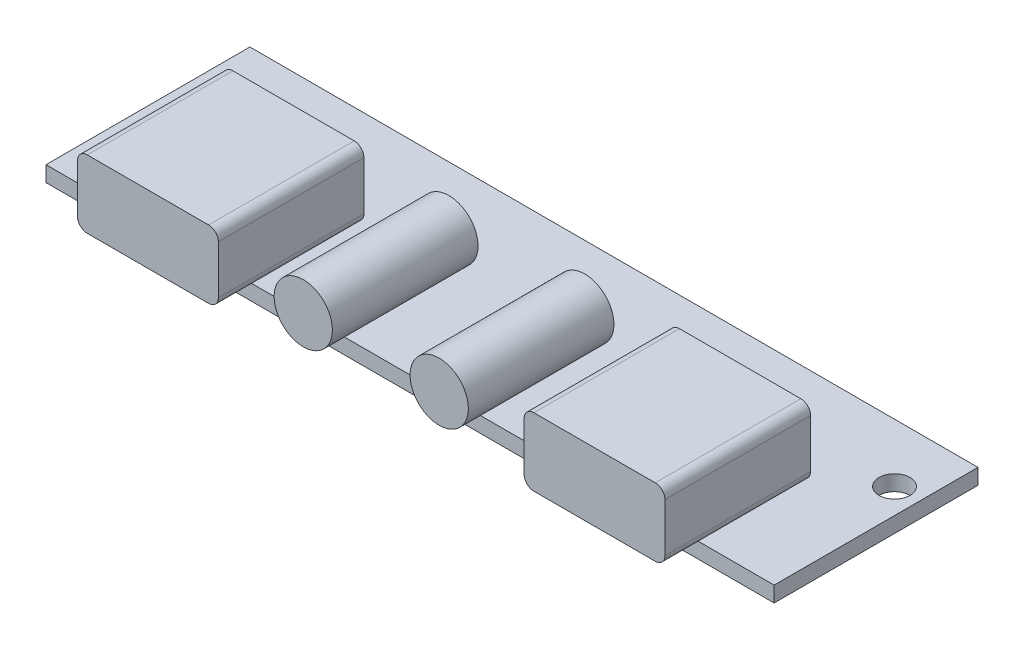
ISO-10303-21;
HEADER;
FILE_DESCRIPTION(('STEP AP214'),'2;1');
FILE_NAME('part.step','',(''),(''),'','','');
FILE_SCHEMA(('AUTOMOTIVE_DESIGN { 1 0 10303 214 1 1 1 1 }'));
ENDSEC;
DATA;
#1=APPLICATION_CONTEXT('core data for automotive mechanical design processes');
#2=APPLICATION_PROTOCOL_DEFINITION('international standard','automotive_design',2000,#1);
#3=PRODUCT_CONTEXT('',#1,'mechanical');
#4=PRODUCT('Part','Part','',(#3));
#5=PRODUCT_RELATED_PRODUCT_CATEGORY('part','',(#4));
#6=PRODUCT_DEFINITION_FORMATION('','',#4);
#7=PRODUCT_DEFINITION_CONTEXT('part definition',#1,'design');
#8=PRODUCT_DEFINITION('design','',#6,#7);
#9=PRODUCT_DEFINITION_SHAPE('','',#8);
#10=(LENGTH_UNIT() NAMED_UNIT(*) SI_UNIT(.MILLI.,.METRE.));
#11=(NAMED_UNIT(*) PLANE_ANGLE_UNIT() SI_UNIT($,.RADIAN.));
#12=(NAMED_UNIT(*) SI_UNIT($,.STERADIAN.) SOLID_ANGLE_UNIT());
#13=UNCERTAINTY_MEASURE_WITH_UNIT(LENGTH_MEASURE(1.E-05),#10,'distance_accuracy_value','');
#14=(GEOMETRIC_REPRESENTATION_CONTEXT(3) GLOBAL_UNCERTAINTY_ASSIGNED_CONTEXT((#13)) GLOBAL_UNIT_ASSIGNED_CONTEXT((#10,
#11,#12)) REPRESENTATION_CONTEXT('',''));
#15=CARTESIAN_POINT('',(0.,0.,0.));
#16=DIRECTION('',(0.,0.,1.));
#17=DIRECTION('',(1.,0.,0.));
#18=AXIS2_PLACEMENT_3D('',#15,#16,#17);
#19=CARTESIAN_POINT('',(7.,5.6,-0.499999999999991));
#20=DIRECTION('',(0.,0.,1.));
#21=DIRECTION('',(-1.,0.,0.));
#22=AXIS2_PLACEMENT_3D('',#19,#20,#21);
#23=CYLINDRICAL_SURFACE('',#22,3.);
#24=CARTESIAN_POINT('',(7.,5.6,-0.499999999999991));
#25=DIRECTION('',(0.,0.,-1.));
#26=DIRECTION('',(-1.,0.,0.));
#27=AXIS2_PLACEMENT_3D('',#24,#25,#26);
#28=CIRCLE('',#27,3.);
#29=CARTESIAN_POINT('',(4.,5.6,-0.499999999999992));
#30=VERTEX_POINT('',#29);
#31=EDGE_CURVE('E11',#30,#30,#28,.T.);
#32=ORIENTED_EDGE('',*,*,#31,.F.);
#33=EDGE_LOOP('',(#32));
#34=FACE_BOUND('',#33,.T.);
#35=CARTESIAN_POINT('',(7.,5.6,14.5));
#36=DIRECTION('',(0.,0.,-1.));
#37=DIRECTION('',(-1.,0.,0.));
#38=AXIS2_PLACEMENT_3D('',#35,#36,#37);
#39=CIRCLE('',#38,3.);
#40=CARTESIAN_POINT('',(4.,5.6,14.5));
#41=VERTEX_POINT('',#40);
#42=EDGE_CURVE('E44',#41,#41,#39,.T.);
#43=ORIENTED_EDGE('',*,*,#42,.T.);
#44=EDGE_LOOP('',(#43));
#45=FACE_BOUND('',#44,.T.);
#46=ADVANCED_FACE('F41',(#34,#45),#23,.T.);
#47=CARTESIAN_POINT('',(7.,5.6,-0.499999999999991));
#48=DIRECTION('',(0.,0.,1.));
#49=DIRECTION('',(-1.,0.,0.));
#50=AXIS2_PLACEMENT_3D('',#47,#48,#49);
#51=PLANE('',#50);
#52=ORIENTED_EDGE('',*,*,#31,.T.);
#53=EDGE_LOOP('',(#52));
#54=FACE_BOUND('',#53,.T.);
#55=ADVANCED_FACE('F56',(#54),#51,.F.);
#56=CARTESIAN_POINT('',(7.,5.6,14.5));
#57=DIRECTION('',(0.,0.,1.));
#58=DIRECTION('',(-1.,0.,0.));
#59=AXIS2_PLACEMENT_3D('',#56,#57,#58);
#60=PLANE('',#59);
#61=ORIENTED_EDGE('',*,*,#42,.F.);
#62=EDGE_LOOP('',(#61));
#63=FACE_BOUND('',#62,.T.);
#64=ADVANCED_FACE('F54',(#63),#60,.T.);
#65=CLOSED_SHELL('',(#46,#55,#64));
#66=MANIFOLD_SOLID_BREP('B2',#65);
#67=CARTESIAN_POINT('',(29.25,2.6,-0.499999999999984));
#68=DIRECTION('',(0.,0.,1.));
#69=DIRECTION('',(-1.,0.,0.));
#70=AXIS2_PLACEMENT_3D('',#67,#68,#69);
#71=CYLINDRICAL_SURFACE('',#70,1.);
#72=CARTESIAN_POINT('',(29.25,2.6,14.5));
#73=DIRECTION('',(0.,0.,-1.));
#74=DIRECTION('',(1.,0.,0.));
#75=AXIS2_PLACEMENT_3D('',#72,#73,#74);
#76=CIRCLE('',#75,1.);
#77=CARTESIAN_POINT('',(30.25,2.6,14.5));
#78=VERTEX_POINT('',#77);
#79=CARTESIAN_POINT('',(29.25,1.6,14.5));
#80=VERTEX_POINT('',#79);
#81=EDGE_CURVE('E187',#78,#80,#76,.T.);
#82=ORIENTED_EDGE('',*,*,#81,.T.);
#83=DIRECTION('',(0.,0.,1.));
#84=VECTOR('',#83,1.);
#85=CARTESIAN_POINT('',(29.25,1.6,-0.499999999999984));
#86=LINE('',#85,#84);
#87=CARTESIAN_POINT('',(29.25,1.6,-0.499999999999984));
#88=VERTEX_POINT('',#87);
#89=EDGE_CURVE('E94',#88,#80,#86,.T.);
#90=ORIENTED_EDGE('',*,*,#89,.F.);
#91=CARTESIAN_POINT('',(29.25,2.6,-0.499999999999984));
#92=DIRECTION('',(0.,0.,-1.));
#93=DIRECTION('',(1.,0.,0.));
#94=AXIS2_PLACEMENT_3D('',#91,#92,#93);
#95=CIRCLE('',#94,1.);
#96=CARTESIAN_POINT('',(30.25,2.6,-0.499999999999984));
#97=VERTEX_POINT('',#96);
#98=EDGE_CURVE('E200',#97,#88,#95,.T.);
#99=ORIENTED_EDGE('',*,*,#98,.F.);
#100=DIRECTION('',(0.,0.,1.));
#101=VECTOR('',#100,1.);
#102=CARTESIAN_POINT('',(30.25,2.6,-0.499999999999984));
#103=LINE('',#102,#101);
#104=EDGE_CURVE('E39',#97,#78,#103,.T.);
#105=ORIENTED_EDGE('',*,*,#104,.T.);
#106=EDGE_LOOP('',(#82,#90,#99,#105));
#107=FACE_BOUND('',#106,.T.);
#108=ADVANCED_FACE('F91',(#107),#71,.T.);
#109=CARTESIAN_POINT('',(30.25,7.6,-0.499999999999984));
#110=DIRECTION('',(1.,0.,0.));
#111=DIRECTION('',(0.,-1.,0.));
#112=AXIS2_PLACEMENT_3D('',#109,#110,#111);
#113=PLANE('',#112);
#114=DIRECTION('',(0.,-1.,0.));
#115=VECTOR('',#114,1.);
#116=CARTESIAN_POINT('',(30.25,7.6,14.5));
#117=LINE('',#116,#115);
#118=CARTESIAN_POINT('',(30.25,7.6,14.5));
#119=VERTEX_POINT('',#118);
#120=EDGE_CURVE('E144',#119,#78,#117,.T.);
#121=ORIENTED_EDGE('',*,*,#120,.T.);
#122=ORIENTED_EDGE('',*,*,#104,.F.);
#123=DIRECTION('',(0.,-1.,0.));
#124=VECTOR('',#123,1.);
#125=CARTESIAN_POINT('',(30.25,7.6,-0.499999999999984));
#126=LINE('',#125,#124);
#127=CARTESIAN_POINT('',(30.25,7.6,-0.499999999999984));
#128=VERTEX_POINT('',#127);
#129=EDGE_CURVE('E109',#128,#97,#126,.T.);
#130=ORIENTED_EDGE('',*,*,#129,.F.);
#131=DIRECTION('',(0.,0.,1.));
#132=VECTOR('',#131,1.);
#133=CARTESIAN_POINT('',(30.25,7.6,-0.499999999999984));
#134=LINE('',#133,#132);
#135=EDGE_CURVE('E100',#128,#119,#134,.T.);
#136=ORIENTED_EDGE('',*,*,#135,.T.);
#137=EDGE_LOOP('',(#121,#122,#130,#136));
#138=FACE_BOUND('',#137,.T.);
#139=ADVANCED_FACE('F246',(#138),#113,.T.);
#140=CARTESIAN_POINT('',(29.25,7.6,-0.499999999999984));
#141=DIRECTION('',(0.,0.,1.));
#142=DIRECTION('',(-1.,0.,0.));
#143=AXIS2_PLACEMENT_3D('',#140,#141,#142);
#144=CYLINDRICAL_SURFACE('',#143,0.999999999999999);
#145=CARTESIAN_POINT('',(29.25,7.6,14.5));
#146=DIRECTION('',(0.,0.,-1.));
#147=DIRECTION('',(-1.,0.,0.));
#148=AXIS2_PLACEMENT_3D('',#145,#146,#147);
#149=CIRCLE('',#148,0.999999999999999);
#150=CARTESIAN_POINT('',(29.25,8.6,14.5));
#151=VERTEX_POINT('',#150);
#152=EDGE_CURVE('E138',#151,#119,#149,.T.);
#153=ORIENTED_EDGE('',*,*,#152,.T.);
#154=ORIENTED_EDGE('',*,*,#135,.F.);
#155=CARTESIAN_POINT('',(29.25,7.6,-0.499999999999984));
#156=DIRECTION('',(0.,0.,-1.));
#157=DIRECTION('',(-1.,0.,0.));
#158=AXIS2_PLACEMENT_3D('',#155,#156,#157);
#159=CIRCLE('',#158,0.999999999999999);
#160=CARTESIAN_POINT('',(29.25,8.6,-0.499999999999984));
#161=VERTEX_POINT('',#160);
#162=EDGE_CURVE('E169',#161,#128,#159,.T.);
#163=ORIENTED_EDGE('',*,*,#162,.F.);
#164=DIRECTION('',(0.,0.,1.));
#165=VECTOR('',#164,1.);
#166=CARTESIAN_POINT('',(29.25,8.6,-0.499999999999984));
#167=LINE('',#166,#165);
#168=EDGE_CURVE('E176',#161,#151,#167,.T.);
#169=ORIENTED_EDGE('',*,*,#168,.T.);
#170=EDGE_LOOP('',(#153,#154,#163,#169));
#171=FACE_BOUND('',#170,.T.);
#172=ADVANCED_FACE('F182',(#171),#144,.T.);
#173=CARTESIAN_POINT('',(29.25,8.6,-0.499999999999984));
#174=DIRECTION('',(0.,1.,0.));
#175=DIRECTION('',(0.,0.,1.));
#176=AXIS2_PLACEMENT_3D('',#173,#174,#175);
#177=PLANE('',#176);
#178=DIRECTION('',(1.,0.,0.));
#179=VECTOR('',#178,1.);
#180=CARTESIAN_POINT('',(29.25,8.6,14.5));
#181=LINE('',#180,#179);
#182=CARTESIAN_POINT('',(16.75,8.6,14.5));
#183=VERTEX_POINT('',#182);
#184=EDGE_CURVE('E179',#183,#151,#181,.T.);
#185=ORIENTED_EDGE('',*,*,#184,.T.);
#186=ORIENTED_EDGE('',*,*,#168,.F.);
#187=DIRECTION('',(1.,0.,0.));
#188=VECTOR('',#187,1.);
#189=CARTESIAN_POINT('',(29.25,8.6,-0.499999999999984));
#190=LINE('',#189,#188);
#191=CARTESIAN_POINT('',(16.75,8.6,-0.499999999999988));
#192=VERTEX_POINT('',#191);
#193=EDGE_CURVE('E165',#192,#161,#190,.T.);
#194=ORIENTED_EDGE('',*,*,#193,.F.);
#195=DIRECTION('',(0.,0.,1.));
#196=VECTOR('',#195,1.);
#197=CARTESIAN_POINT('',(16.75,8.6,-0.499999999999988));
#198=LINE('',#197,#196);
#199=EDGE_CURVE('E180',#192,#183,#198,.T.);
#200=ORIENTED_EDGE('',*,*,#199,.T.);
#201=EDGE_LOOP('',(#185,#186,#194,#200));
#202=FACE_BOUND('',#201,.T.);
#203=ADVANCED_FACE('F177',(#202),#177,.T.);
#204=CARTESIAN_POINT('',(16.75,7.6,-0.499999999999988));
#205=DIRECTION('',(0.,0.,1.));
#206=DIRECTION('',(-1.,0.,0.));
#207=AXIS2_PLACEMENT_3D('',#204,#205,#206);
#208=CYLINDRICAL_SURFACE('',#207,1.);
#209=CARTESIAN_POINT('',(16.75,7.6,14.5));
#210=DIRECTION('',(0.,0.,-1.));
#211=DIRECTION('',(1.,0.,0.));
#212=AXIS2_PLACEMENT_3D('',#209,#210,#211);
#213=CIRCLE('',#212,1.);
#214=CARTESIAN_POINT('',(15.75,7.6,14.5));
#215=VERTEX_POINT('',#214);
#216=EDGE_CURVE('E196',#215,#183,#213,.T.);
#217=ORIENTED_EDGE('',*,*,#216,.T.);
#218=ORIENTED_EDGE('',*,*,#199,.F.);
#219=CARTESIAN_POINT('',(16.75,7.6,-0.499999999999988));
#220=DIRECTION('',(0.,0.,-1.));
#221=DIRECTION('',(1.,0.,0.));
#222=AXIS2_PLACEMENT_3D('',#219,#220,#221);
#223=CIRCLE('',#222,1.);
#224=CARTESIAN_POINT('',(15.75,7.6,-0.499999999999988));
#225=VERTEX_POINT('',#224);
#226=EDGE_CURVE('E171',#225,#192,#223,.T.);
#227=ORIENTED_EDGE('',*,*,#226,.F.);
#228=DIRECTION('',(0.,0.,1.));
#229=VECTOR('',#228,1.);
#230=CARTESIAN_POINT('',(15.75,7.6,-0.499999999999988));
#231=LINE('',#230,#229);
#232=EDGE_CURVE('E204',#225,#215,#231,.T.);
#233=ORIENTED_EDGE('',*,*,#232,.T.);
#234=EDGE_LOOP('',(#217,#218,#227,#233));
#235=FACE_BOUND('',#234,.T.);
#236=ADVANCED_FACE('F236',(#235),#208,.T.);
#237=CARTESIAN_POINT('',(15.75,7.6,-0.499999999999988));
#238=DIRECTION('',(-1.,0.,0.));
#239=DIRECTION('',(0.,1.,0.));
#240=AXIS2_PLACEMENT_3D('',#237,#238,#239);
#241=PLANE('',#240);
#242=DIRECTION('',(0.,1.,0.));
#243=VECTOR('',#242,1.);
#244=CARTESIAN_POINT('',(15.75,7.6,14.5));
#245=LINE('',#244,#243);
#246=CARTESIAN_POINT('',(15.75,2.6,14.5));
#247=VERTEX_POINT('',#246);
#248=EDGE_CURVE('E194',#247,#215,#245,.T.);
#249=ORIENTED_EDGE('',*,*,#248,.T.);
#250=ORIENTED_EDGE('',*,*,#232,.F.);
#251=DIRECTION('',(0.,1.,0.));
#252=VECTOR('',#251,1.);
#253=CARTESIAN_POINT('',(15.75,7.6,-0.499999999999988));
#254=LINE('',#253,#252);
#255=CARTESIAN_POINT('',(15.75,2.6,-0.499999999999988));
#256=VERTEX_POINT('',#255);
#257=EDGE_CURVE('E229',#256,#225,#254,.T.);
#258=ORIENTED_EDGE('',*,*,#257,.F.);
#259=DIRECTION('',(0.,0.,1.));
#260=VECTOR('',#259,1.);
#261=CARTESIAN_POINT('',(15.75,2.6,-0.499999999999988));
#262=LINE('',#261,#260);
#263=EDGE_CURVE('E207',#256,#247,#262,.T.);
#264=ORIENTED_EDGE('',*,*,#263,.T.);
#265=EDGE_LOOP('',(#249,#250,#258,#264));
#266=FACE_BOUND('',#265,.T.);
#267=ADVANCED_FACE('F227',(#266),#241,.T.);
#268=CARTESIAN_POINT('',(16.75,2.6,-0.499999999999988));
#269=DIRECTION('',(0.,0.,1.));
#270=DIRECTION('',(-1.,0.,0.));
#271=AXIS2_PLACEMENT_3D('',#268,#269,#270);
#272=CYLINDRICAL_SURFACE('',#271,0.999999999999999);
#273=CARTESIAN_POINT('',(16.75,2.6,14.5));
#274=DIRECTION('',(0.,0.,-1.));
#275=DIRECTION('',(1.,0.,0.));
#276=AXIS2_PLACEMENT_3D('',#273,#274,#275);
#277=CIRCLE('',#276,0.999999999999999);
#278=CARTESIAN_POINT('',(16.75,1.6,14.5));
#279=VERTEX_POINT('',#278);
#280=EDGE_CURVE('E192',#279,#247,#277,.T.);
#281=ORIENTED_EDGE('',*,*,#280,.T.);
#282=ORIENTED_EDGE('',*,*,#263,.F.);
#283=CARTESIAN_POINT('',(16.75,2.6,-0.499999999999988));
#284=DIRECTION('',(0.,0.,-1.));
#285=DIRECTION('',(1.,0.,0.));
#286=AXIS2_PLACEMENT_3D('',#283,#284,#285);
#287=CIRCLE('',#286,0.999999999999999);
#288=CARTESIAN_POINT('',(16.75,1.6,-0.499999999999988));
#289=VERTEX_POINT('',#288);
#290=EDGE_CURVE('E230',#289,#256,#287,.T.);
#291=ORIENTED_EDGE('',*,*,#290,.F.);
#292=DIRECTION('',(0.,0.,1.));
#293=VECTOR('',#292,1.);
#294=CARTESIAN_POINT('',(16.75,1.6,-0.499999999999988));
#295=LINE('',#294,#293);
#296=EDGE_CURVE('E209',#289,#279,#295,.T.);
#297=ORIENTED_EDGE('',*,*,#296,.T.);
#298=EDGE_LOOP('',(#281,#282,#291,#297));
#299=FACE_BOUND('',#298,.T.);
#300=ADVANCED_FACE('F224',(#299),#272,.T.);
#301=CARTESIAN_POINT('',(29.25,1.6,-0.499999999999984));
#302=DIRECTION('',(0.,-1.,0.));
#303=DIRECTION('',(0.,0.,-1.));
#304=AXIS2_PLACEMENT_3D('',#301,#302,#303);
#305=PLANE('',#304);
#306=DIRECTION('',(-1.,0.,0.));
#307=VECTOR('',#306,1.);
#308=CARTESIAN_POINT('',(29.25,1.6,14.5));
#309=LINE('',#308,#307);
#310=EDGE_CURVE('E190',#80,#279,#309,.T.);
#311=ORIENTED_EDGE('',*,*,#310,.T.);
#312=ORIENTED_EDGE('',*,*,#296,.F.);
#313=DIRECTION('',(-1.,0.,0.));
#314=VECTOR('',#313,1.);
#315=CARTESIAN_POINT('',(29.25,1.6,-0.499999999999984));
#316=LINE('',#315,#314);
#317=EDGE_CURVE('E152',#88,#289,#316,.T.);
#318=ORIENTED_EDGE('',*,*,#317,.F.);
#319=ORIENTED_EDGE('',*,*,#89,.T.);
#320=EDGE_LOOP('',(#311,#312,#318,#319));
#321=FACE_BOUND('',#320,.T.);
#322=ADVANCED_FACE('F215',(#321),#305,.T.);
#323=CARTESIAN_POINT('',(29.25,2.6,-0.499999999999984));
#324=DIRECTION('',(0.,0.,-1.));
#325=DIRECTION('',(1.,0.,0.));
#326=AXIS2_PLACEMENT_3D('',#323,#324,#325);
#327=PLANE('',#326);
#328=ORIENTED_EDGE('',*,*,#98,.T.);
#329=ORIENTED_EDGE('',*,*,#317,.T.);
#330=ORIENTED_EDGE('',*,*,#290,.T.);
#331=ORIENTED_EDGE('',*,*,#257,.T.);
#332=ORIENTED_EDGE('',*,*,#226,.T.);
#333=ORIENTED_EDGE('',*,*,#193,.T.);
#334=ORIENTED_EDGE('',*,*,#162,.T.);
#335=ORIENTED_EDGE('',*,*,#129,.T.);
#336=EDGE_LOOP('',(#328,#329,#330,#331,#332,#333,#334,#335));
#337=FACE_BOUND('',#336,.T.);
#338=ADVANCED_FACE('F167',(#337),#327,.T.);
#339=CARTESIAN_POINT('',(29.25,2.6,14.5));
#340=DIRECTION('',(0.,0.,-1.));
#341=DIRECTION('',(1.,0.,0.));
#342=AXIS2_PLACEMENT_3D('',#339,#340,#341);
#343=PLANE('',#342);
#344=ORIENTED_EDGE('',*,*,#81,.F.);
#345=ORIENTED_EDGE('',*,*,#120,.F.);
#346=ORIENTED_EDGE('',*,*,#152,.F.);
#347=ORIENTED_EDGE('',*,*,#184,.F.);
#348=ORIENTED_EDGE('',*,*,#216,.F.);
#349=ORIENTED_EDGE('',*,*,#248,.F.);
#350=ORIENTED_EDGE('',*,*,#280,.F.);
#351=ORIENTED_EDGE('',*,*,#310,.F.);
#352=EDGE_LOOP('',(#344,#345,#346,#347,#348,#349,#350,#351));
#353=FACE_BOUND('',#352,.T.);
#354=ADVANCED_FACE('F220',(#353),#343,.F.);
#355=CLOSED_SHELL('',(#108,#139,#172,#203,#236,#267,#300,#322,#338,#354));
#356=MANIFOLD_SOLID_BREP('B6',#355);
#357=CARTESIAN_POINT('',(-29.25,2.6,-0.499999999999994));
#358=DIRECTION('',(0.,0.,1.));
#359=DIRECTION('',(1.,0.,0.));
#360=AXIS2_PLACEMENT_3D('',#357,#358,#359);
#361=CYLINDRICAL_SURFACE('',#360,1.);
#362=CARTESIAN_POINT('',(-29.25,2.6,14.5));
#363=DIRECTION('',(0.,0.,1.));
#364=DIRECTION('',(-1.,0.,0.));
#365=AXIS2_PLACEMENT_3D('',#362,#363,#364);
#366=CIRCLE('',#365,1.);
#367=CARTESIAN_POINT('',(-30.25,2.6,14.5));
#368=VERTEX_POINT('',#367);
#369=CARTESIAN_POINT('',(-29.25,1.6,14.5));
#370=VERTEX_POINT('',#369);
#371=EDGE_CURVE('E423',#368,#370,#366,.T.);
#372=ORIENTED_EDGE('',*,*,#371,.F.);
#373=DIRECTION('',(0.,0.,1.));
#374=VECTOR('',#373,1.);
#375=CARTESIAN_POINT('',(-30.25,2.6,-0.499999999999994));
#376=LINE('',#375,#374);
#377=CARTESIAN_POINT('',(-30.25,2.6,-0.499999999999994));
#378=VERTEX_POINT('',#377);
#379=EDGE_CURVE('E89',#378,#368,#376,.T.);
#380=ORIENTED_EDGE('',*,*,#379,.F.);
#381=CARTESIAN_POINT('',(-29.25,2.6,-0.499999999999994));
#382=DIRECTION('',(0.,0.,1.));
#383=DIRECTION('',(-1.,0.,0.));
#384=AXIS2_PLACEMENT_3D('',#381,#382,#383);
#385=CIRCLE('',#384,1.);
#386=CARTESIAN_POINT('',(-29.25,1.6,-0.499999999999994));
#387=VERTEX_POINT('',#386);
#388=EDGE_CURVE('E443',#378,#387,#385,.T.);
#389=ORIENTED_EDGE('',*,*,#388,.T.);
#390=DIRECTION('',(0.,0.,1.));
#391=VECTOR('',#390,1.);
#392=CARTESIAN_POINT('',(-29.25,1.6,-0.499999999999994));
#393=LINE('',#392,#391);
#394=EDGE_CURVE('E329',#387,#370,#393,.T.);
#395=ORIENTED_EDGE('',*,*,#394,.T.);
#396=EDGE_LOOP('',(#372,#380,#389,#395));
#397=FACE_BOUND('',#396,.T.);
#398=ADVANCED_FACE('F326',(#397),#361,.T.);
#399=CARTESIAN_POINT('',(-30.25,7.6,-0.499999999999994));
#400=DIRECTION('',(-1.,0.,0.));
#401=DIRECTION('',(0.,-1.,0.));
#402=AXIS2_PLACEMENT_3D('',#399,#400,#401);
#403=PLANE('',#402);
#404=DIRECTION('',(0.,-1.,0.));
#405=VECTOR('',#404,1.);
#406=CARTESIAN_POINT('',(-30.25,7.6,14.5));
#407=LINE('',#406,#405);
#408=CARTESIAN_POINT('',(-30.25,7.6,14.5));
#409=VERTEX_POINT('',#408);
#410=EDGE_CURVE('E441',#409,#368,#407,.T.);
#411=ORIENTED_EDGE('',*,*,#410,.F.);
#412=DIRECTION('',(0.,0.,1.));
#413=VECTOR('',#412,1.);
#414=CARTESIAN_POINT('',(-30.25,7.6,-0.499999999999994));
#415=LINE('',#414,#413);
#416=CARTESIAN_POINT('',(-30.25,7.6,-0.499999999999994));
#417=VERTEX_POINT('',#416);
#418=EDGE_CURVE('E335',#417,#409,#415,.T.);
#419=ORIENTED_EDGE('',*,*,#418,.F.);
#420=DIRECTION('',(0.,-1.,0.));
#421=VECTOR('',#420,1.);
#422=CARTESIAN_POINT('',(-30.25,7.6,-0.499999999999994));
#423=LINE('',#422,#421);
#424=EDGE_CURVE('E413',#417,#378,#423,.T.);
#425=ORIENTED_EDGE('',*,*,#424,.T.);
#426=ORIENTED_EDGE('',*,*,#379,.T.);
#427=EDGE_LOOP('',(#411,#419,#425,#426));
#428=FACE_BOUND('',#427,.T.);
#429=ADVANCED_FACE('F455',(#428),#403,.T.);
#430=CARTESIAN_POINT('',(-29.25,7.6,-0.499999999999994));
#431=DIRECTION('',(0.,0.,1.));
#432=DIRECTION('',(1.,0.,0.));
#433=AXIS2_PLACEMENT_3D('',#430,#431,#432);
#434=CYLINDRICAL_SURFACE('',#433,0.999999999999999);
#435=CARTESIAN_POINT('',(-29.25,7.6,14.5));
#436=DIRECTION('',(0.,0.,1.));
#437=DIRECTION('',(1.,0.,0.));
#438=AXIS2_PLACEMENT_3D('',#435,#436,#437);
#439=CIRCLE('',#438,0.999999999999999);
#440=CARTESIAN_POINT('',(-29.25,8.6,14.5));
#441=VERTEX_POINT('',#440);
#442=EDGE_CURVE('E400',#441,#409,#439,.T.);
#443=ORIENTED_EDGE('',*,*,#442,.F.);
#444=DIRECTION('',(0.,0.,1.));
#445=VECTOR('',#444,1.);
#446=CARTESIAN_POINT('',(-29.25,8.6,-0.499999999999994));
#447=LINE('',#446,#445);
#448=CARTESIAN_POINT('',(-29.25,8.6,-0.499999999999994));
#449=VERTEX_POINT('',#448);
#450=EDGE_CURVE('E395',#449,#441,#447,.T.);
#451=ORIENTED_EDGE('',*,*,#450,.F.);
#452=CARTESIAN_POINT('',(-29.25,7.6,-0.499999999999994));
#453=DIRECTION('',(0.,0.,1.));
#454=DIRECTION('',(1.,0.,0.));
#455=AXIS2_PLACEMENT_3D('',#452,#453,#454);
#456=CIRCLE('',#455,0.999999999999999);
#457=EDGE_CURVE('E398',#449,#417,#456,.T.);
#458=ORIENTED_EDGE('',*,*,#457,.T.);
#459=ORIENTED_EDGE('',*,*,#418,.T.);
#460=EDGE_LOOP('',(#443,#451,#458,#459));
#461=FACE_BOUND('',#460,.T.);
#462=ADVANCED_FACE('F397',(#461),#434,.T.);
#463=CARTESIAN_POINT('',(-29.25,8.6,-0.499999999999994));
#464=DIRECTION('',(0.,1.,0.));
#465=DIRECTION('',(0.,0.,1.));
#466=AXIS2_PLACEMENT_3D('',#463,#464,#465);
#467=PLANE('',#466);
#468=DIRECTION('',(-1.,0.,0.));
#469=VECTOR('',#468,1.);
#470=CARTESIAN_POINT('',(-29.25,8.6,14.5));
#471=LINE('',#470,#469);
#472=CARTESIAN_POINT('',(-16.75,8.6,14.5));
#473=VERTEX_POINT('',#472);
#474=EDGE_CURVE('E438',#473,#441,#471,.T.);
#475=ORIENTED_EDGE('',*,*,#474,.F.);
#476=DIRECTION('',(0.,0.,1.));
#477=VECTOR('',#476,1.);
#478=CARTESIAN_POINT('',(-16.75,8.6,-0.499999999999994));
#479=LINE('',#478,#477);
#480=CARTESIAN_POINT('',(-16.75,8.6,-0.499999999999994));
#481=VERTEX_POINT('',#480);
#482=EDGE_CURVE('E405',#481,#473,#479,.T.);
#483=ORIENTED_EDGE('',*,*,#482,.F.);
#484=DIRECTION('',(-1.,0.,0.));
#485=VECTOR('',#484,1.);
#486=CARTESIAN_POINT('',(-29.25,8.6,-0.499999999999994));
#487=LINE('',#486,#485);
#488=EDGE_CURVE('E411',#481,#449,#487,.T.);
#489=ORIENTED_EDGE('',*,*,#488,.T.);
#490=ORIENTED_EDGE('',*,*,#450,.T.);
#491=EDGE_LOOP('',(#475,#483,#489,#490));
#492=FACE_BOUND('',#491,.T.);
#493=ADVANCED_FACE('F415',(#492),#467,.T.);
#494=CARTESIAN_POINT('',(-16.75,7.6,-0.499999999999994));
#495=DIRECTION('',(0.,0.,1.));
#496=DIRECTION('',(1.,0.,0.));
#497=AXIS2_PLACEMENT_3D('',#494,#495,#496);
#498=CYLINDRICAL_SURFACE('',#497,1.);
#499=CARTESIAN_POINT('',(-16.75,7.6,14.5));
#500=DIRECTION('',(0.,0.,1.));
#501=DIRECTION('',(-1.,0.,0.));
#502=AXIS2_PLACEMENT_3D('',#499,#500,#501);
#503=CIRCLE('',#502,1.);
#504=CARTESIAN_POINT('',(-15.75,7.6,14.5));
#505=VERTEX_POINT('',#504);
#506=EDGE_CURVE('E435',#505,#473,#503,.T.);
#507=ORIENTED_EDGE('',*,*,#506,.F.);
#508=DIRECTION('',(0.,0.,1.));
#509=VECTOR('',#508,1.);
#510=CARTESIAN_POINT('',(-15.75,7.6,-0.499999999999994));
#511=LINE('',#510,#509);
#512=CARTESIAN_POINT('',(-15.75,7.6,-0.499999999999994));
#513=VERTEX_POINT('',#512);
#514=EDGE_CURVE('E447',#513,#505,#511,.T.);
#515=ORIENTED_EDGE('',*,*,#514,.F.);
#516=CARTESIAN_POINT('',(-16.75,7.6,-0.499999999999994));
#517=DIRECTION('',(0.,0.,1.));
#518=DIRECTION('',(-1.,0.,0.));
#519=AXIS2_PLACEMENT_3D('',#516,#517,#518);
#520=CIRCLE('',#519,1.);
#521=EDGE_CURVE('E416',#513,#481,#520,.T.);
#522=ORIENTED_EDGE('',*,*,#521,.T.);
#523=ORIENTED_EDGE('',*,*,#482,.T.);
#524=EDGE_LOOP('',(#507,#515,#522,#523));
#525=FACE_BOUND('',#524,.T.);
#526=ADVANCED_FACE('F468',(#525),#498,.T.);
#527=CARTESIAN_POINT('',(-15.75,7.6,-0.499999999999994));
#528=DIRECTION('',(1.,0.,0.));
#529=DIRECTION('',(0.,1.,0.));
#530=AXIS2_PLACEMENT_3D('',#527,#528,#529);
#531=PLANE('',#530);
#532=DIRECTION('',(0.,1.,0.));
#533=VECTOR('',#532,1.);
#534=CARTESIAN_POINT('',(-15.75,7.6,14.5));
#535=LINE('',#534,#533);
#536=CARTESIAN_POINT('',(-15.75,2.6,14.5));
#537=VERTEX_POINT('',#536);
#538=EDGE_CURVE('E432',#537,#505,#535,.T.);
#539=ORIENTED_EDGE('',*,*,#538,.F.);
#540=DIRECTION('',(0.,0.,1.));
#541=VECTOR('',#540,1.);
#542=CARTESIAN_POINT('',(-15.75,2.6,-0.499999999999994));
#543=LINE('',#542,#541);
#544=CARTESIAN_POINT('',(-15.75,2.6,-0.499999999999994));
#545=VERTEX_POINT('',#544);
#546=EDGE_CURVE('E449',#545,#537,#543,.T.);
#547=ORIENTED_EDGE('',*,*,#546,.F.);
#548=DIRECTION('',(0.,1.,0.));
#549=VECTOR('',#548,1.);
#550=CARTESIAN_POINT('',(-15.75,7.6,-0.499999999999994));
#551=LINE('',#550,#549);
#552=EDGE_CURVE('E418',#545,#513,#551,.T.);
#553=ORIENTED_EDGE('',*,*,#552,.T.);
#554=ORIENTED_EDGE('',*,*,#514,.T.);
#555=EDGE_LOOP('',(#539,#547,#553,#554));
#556=FACE_BOUND('',#555,.T.);
#557=ADVANCED_FACE('F471',(#556),#531,.T.);
#558=CARTESIAN_POINT('',(-16.75,2.6,-0.499999999999994));
#559=DIRECTION('',(0.,0.,1.));
#560=DIRECTION('',(1.,0.,0.));
#561=AXIS2_PLACEMENT_3D('',#558,#559,#560);
#562=CYLINDRICAL_SURFACE('',#561,0.999999999999999);
#563=CARTESIAN_POINT('',(-16.75,2.6,14.5));
#564=DIRECTION('',(0.,0.,1.));
#565=DIRECTION('',(-1.,0.,0.));
#566=AXIS2_PLACEMENT_3D('',#563,#564,#565);
#567=CIRCLE('',#566,0.999999999999999);
#568=CARTESIAN_POINT('',(-16.75,1.6,14.5));
#569=VERTEX_POINT('',#568);
#570=EDGE_CURVE('E429',#569,#537,#567,.T.);
#571=ORIENTED_EDGE('',*,*,#570,.F.);
#572=DIRECTION('',(0.,0.,1.));
#573=VECTOR('',#572,1.);
#574=CARTESIAN_POINT('',(-16.75,1.6,-0.499999999999994));
#575=LINE('',#574,#573);
#576=CARTESIAN_POINT('',(-16.75,1.6,-0.499999999999994));
#577=VERTEX_POINT('',#576);
#578=EDGE_CURVE('E450',#577,#569,#575,.T.);
#579=ORIENTED_EDGE('',*,*,#578,.F.);
#580=CARTESIAN_POINT('',(-16.75,2.6,-0.499999999999994));
#581=DIRECTION('',(0.,0.,1.));
#582=DIRECTION('',(-1.,0.,0.));
#583=AXIS2_PLACEMENT_3D('',#580,#581,#582);
#584=CIRCLE('',#583,0.999999999999999);
#585=EDGE_CURVE('E546',#577,#545,#584,.T.);
#586=ORIENTED_EDGE('',*,*,#585,.T.);
#587=ORIENTED_EDGE('',*,*,#546,.T.);
#588=EDGE_LOOP('',(#571,#579,#586,#587));
#589=FACE_BOUND('',#588,.T.);
#590=ADVANCED_FACE('F475',(#589),#562,.T.);
#591=CARTESIAN_POINT('',(-29.25,1.6,-0.499999999999994));
#592=DIRECTION('',(0.,-1.,0.));
#593=DIRECTION('',(0.,0.,-1.));
#594=AXIS2_PLACEMENT_3D('',#591,#592,#593);
#595=PLANE('',#594);
#596=DIRECTION('',(1.,0.,0.));
#597=VECTOR('',#596,1.);
#598=CARTESIAN_POINT('',(-29.25,1.6,14.5));
#599=LINE('',#598,#597);
#600=EDGE_CURVE('E426',#370,#569,#599,.T.);
#601=ORIENTED_EDGE('',*,*,#600,.F.);
#602=ORIENTED_EDGE('',*,*,#394,.F.);
#603=DIRECTION('',(1.,0.,0.));
#604=VECTOR('',#603,1.);
#605=CARTESIAN_POINT('',(-29.25,1.6,-0.499999999999994));
#606=LINE('',#605,#604);
#607=EDGE_CURVE('E547',#387,#577,#606,.T.);
#608=ORIENTED_EDGE('',*,*,#607,.T.);
#609=ORIENTED_EDGE('',*,*,#578,.T.);
#610=EDGE_LOOP('',(#601,#602,#608,#609));
#611=FACE_BOUND('',#610,.T.);
#612=ADVANCED_FACE('F452',(#611),#595,.T.);
#613=CARTESIAN_POINT('',(-29.25,2.6,-0.499999999999994));
#614=DIRECTION('',(0.,0.,-1.));
#615=DIRECTION('',(-1.,0.,0.));
#616=AXIS2_PLACEMENT_3D('',#613,#614,#615);
#617=PLANE('',#616);
#618=ORIENTED_EDGE('',*,*,#388,.F.);
#619=ORIENTED_EDGE('',*,*,#424,.F.);
#620=ORIENTED_EDGE('',*,*,#457,.F.);
#621=ORIENTED_EDGE('',*,*,#488,.F.);
#622=ORIENTED_EDGE('',*,*,#521,.F.);
#623=ORIENTED_EDGE('',*,*,#552,.F.);
#624=ORIENTED_EDGE('',*,*,#585,.F.);
#625=ORIENTED_EDGE('',*,*,#607,.F.);
#626=EDGE_LOOP('',(#618,#619,#620,#621,#622,#623,#624,#625));
#627=FACE_BOUND('',#626,.T.);
#628=ADVANCED_FACE('F409',(#627),#617,.T.);
#629=CARTESIAN_POINT('',(-29.25,2.6,14.5));
#630=DIRECTION('',(0.,0.,-1.));
#631=DIRECTION('',(-1.,0.,0.));
#632=AXIS2_PLACEMENT_3D('',#629,#630,#631);
#633=PLANE('',#632);
#634=ORIENTED_EDGE('',*,*,#371,.T.);
#635=ORIENTED_EDGE('',*,*,#600,.T.);
#636=ORIENTED_EDGE('',*,*,#570,.T.);
#637=ORIENTED_EDGE('',*,*,#538,.T.);
#638=ORIENTED_EDGE('',*,*,#506,.T.);
#639=ORIENTED_EDGE('',*,*,#474,.T.);
#640=ORIENTED_EDGE('',*,*,#442,.T.);
#641=ORIENTED_EDGE('',*,*,#410,.T.);
#642=EDGE_LOOP('',(#634,#635,#636,#637,#638,#639,#640,#641));
#643=FACE_BOUND('',#642,.T.);
#644=ADVANCED_FACE('F454',(#643),#633,.F.);
#645=CLOSED_SHELL('',(#398,#429,#462,#493,#526,#557,#590,#612,#628,#644));
#646=MANIFOLD_SOLID_BREP('B33',#645);
#647=CARTESIAN_POINT('',(-7.,5.6,-0.499999999999994));
#648=DIRECTION('',(0.,0.,1.));
#649=DIRECTION('',(1.,0.,0.));
#650=AXIS2_PLACEMENT_3D('',#647,#648,#649);
#651=CYLINDRICAL_SURFACE('',#650,3.);
#652=CARTESIAN_POINT('',(-7.,5.6,-0.499999999999994));
#653=DIRECTION('',(0.,0.,1.));
#654=DIRECTION('',(1.,0.,0.));
#655=AXIS2_PLACEMENT_3D('',#652,#653,#654);
#656=CIRCLE('',#655,3.);
#657=CARTESIAN_POINT('',(-4.,5.6,-0.499999999999994));
#658=VERTEX_POINT('',#657);
#659=EDGE_CURVE('E325',#658,#658,#656,.T.);
#660=ORIENTED_EDGE('',*,*,#659,.T.);
#661=EDGE_LOOP('',(#660));
#662=FACE_BOUND('',#661,.T.);
#663=CARTESIAN_POINT('',(-7.,5.6,14.5));
#664=DIRECTION('',(0.,0.,1.));
#665=DIRECTION('',(1.,0.,0.));
#666=AXIS2_PLACEMENT_3D('',#663,#664,#665);
#667=CIRCLE('',#666,3.);
#668=CARTESIAN_POINT('',(-4.,5.6,14.5));
#669=VERTEX_POINT('',#668);
#670=EDGE_CURVE('E565',#669,#669,#667,.T.);
#671=ORIENTED_EDGE('',*,*,#670,.F.);
#672=EDGE_LOOP('',(#671));
#673=FACE_BOUND('',#672,.T.);
#674=ADVANCED_FACE('F562',(#662,#673),#651,.T.);
#675=CARTESIAN_POINT('',(-7.,5.6,-0.499999999999994));
#676=DIRECTION('',(0.,0.,1.));
#677=DIRECTION('',(1.,0.,0.));
#678=AXIS2_PLACEMENT_3D('',#675,#676,#677);
#679=PLANE('',#678);
#680=ORIENTED_EDGE('',*,*,#659,.F.);
#681=EDGE_LOOP('',(#680));
#682=FACE_BOUND('',#681,.T.);
#683=ADVANCED_FACE('F577',(#682),#679,.F.);
#684=CARTESIAN_POINT('',(-7.,5.6,14.5));
#685=DIRECTION('',(0.,0.,1.));
#686=DIRECTION('',(1.,0.,0.));
#687=AXIS2_PLACEMENT_3D('',#684,#685,#686);
#688=PLANE('',#687);
#689=ORIENTED_EDGE('',*,*,#670,.T.);
#690=EDGE_LOOP('',(#689));
#691=FACE_BOUND('',#690,.T.);
#692=ADVANCED_FACE('F574',(#691),#688,.T.);
#693=CLOSED_SHELL('',(#674,#683,#692));
#694=MANIFOLD_SOLID_BREP('B83',#693);
#695=CARTESIAN_POINT('',(37.5,1.6,-10.5));
#696=DIRECTION('',(-1.,0.,0.));
#697=DIRECTION('',(0.,0.,1.));
#698=AXIS2_PLACEMENT_3D('',#695,#696,#697);
#699=PLANE('',#698);
#700=DIRECTION('',(0.,0.,-1.));
#701=VECTOR('',#700,1.);
#702=CARTESIAN_POINT('',(37.5,0.,-10.5));
#703=LINE('',#702,#701);
#704=CARTESIAN_POINT('',(37.5,0.,10.5));
#705=VERTEX_POINT('',#704);
#706=CARTESIAN_POINT('',(37.5,0.,-10.5));
#707=VERTEX_POINT('',#706);
#708=EDGE_CURVE('E666',#705,#707,#703,.T.);
#709=ORIENTED_EDGE('',*,*,#708,.T.);
#710=DIRECTION('',(0.,-1.,0.));
#711=VECTOR('',#710,1.);
#712=CARTESIAN_POINT('',(37.5,1.6,-10.5));
#713=LINE('',#712,#711);
#714=CARTESIAN_POINT('',(37.5,1.6,-10.5));
#715=VERTEX_POINT('',#714);
#716=EDGE_CURVE('E560',#715,#707,#713,.T.);
#717=ORIENTED_EDGE('',*,*,#716,.F.);
#718=DIRECTION('',(0.,0.,-1.));
#719=VECTOR('',#718,1.);
#720=CARTESIAN_POINT('',(37.5,1.6,-10.5));
#721=LINE('',#720,#719);
#722=CARTESIAN_POINT('',(37.5,1.6,10.5));
#723=VERTEX_POINT('',#722);
#724=EDGE_CURVE('E654',#723,#715,#721,.T.);
#725=ORIENTED_EDGE('',*,*,#724,.F.);
#726=DIRECTION('',(0.,-1.,0.));
#727=VECTOR('',#726,1.);
#728=CARTESIAN_POINT('',(37.5,1.6,10.5));
#729=LINE('',#728,#727);
#730=EDGE_CURVE('E662',#723,#705,#729,.T.);
#731=ORIENTED_EDGE('',*,*,#730,.T.);
#732=EDGE_LOOP('',(#709,#717,#725,#731));
#733=FACE_BOUND('',#732,.T.);
#734=ADVANCED_FACE('F603',(#733),#699,.F.);
#735=CARTESIAN_POINT('',(-37.5,1.6,-10.5));
#736=DIRECTION('',(0.,0.,1.));
#737=DIRECTION('',(1.,0.,0.));
#738=AXIS2_PLACEMENT_3D('',#735,#736,#737);
#739=PLANE('',#738);
#740=DIRECTION('',(-1.,0.,0.));
#741=VECTOR('',#740,1.);
#742=CARTESIAN_POINT('',(-37.5,0.,-10.5));
#743=LINE('',#742,#741);
#744=CARTESIAN_POINT('',(-37.5,0.,-10.5));
#745=VERTEX_POINT('',#744);
#746=EDGE_CURVE('E658',#707,#745,#743,.T.);
#747=ORIENTED_EDGE('',*,*,#746,.T.);
#748=DIRECTION('',(0.,-1.,0.));
#749=VECTOR('',#748,1.);
#750=CARTESIAN_POINT('',(-37.5,1.6,-10.5));
#751=LINE('',#750,#749);
#752=CARTESIAN_POINT('',(-37.5,1.6,-10.5));
#753=VERTEX_POINT('',#752);
#754=EDGE_CURVE('E611',#753,#745,#751,.T.);
#755=ORIENTED_EDGE('',*,*,#754,.F.);
#756=DIRECTION('',(-1.,0.,0.));
#757=VECTOR('',#756,1.);
#758=CARTESIAN_POINT('',(-37.5,1.6,-10.5));
#759=LINE('',#758,#757);
#760=EDGE_CURVE('E649',#715,#753,#759,.T.);
#761=ORIENTED_EDGE('',*,*,#760,.F.);
#762=ORIENTED_EDGE('',*,*,#716,.T.);
#763=EDGE_LOOP('',(#747,#755,#761,#762));
#764=FACE_BOUND('',#763,.T.);
#765=ADVANCED_FACE('F657',(#764),#739,.F.);
#766=CARTESIAN_POINT('',(-37.5,1.6,-10.5));
#767=DIRECTION('',(1.,0.,0.));
#768=DIRECTION('',(0.,0.,-1.));
#769=AXIS2_PLACEMENT_3D('',#766,#767,#768);
#770=PLANE('',#769);
#771=DIRECTION('',(0.,0.,1.));
#772=VECTOR('',#771,1.);
#773=CARTESIAN_POINT('',(-37.5,0.,-10.5));
#774=LINE('',#773,#772);
#775=CARTESIAN_POINT('',(-37.5,0.,10.5));
#776=VERTEX_POINT('',#775);
#777=EDGE_CURVE('E636',#745,#776,#774,.T.);
#778=ORIENTED_EDGE('',*,*,#777,.T.);
#779=DIRECTION('',(0.,-1.,0.));
#780=VECTOR('',#779,1.);
#781=CARTESIAN_POINT('',(-37.5,1.6,10.5));
#782=LINE('',#781,#780);
#783=CARTESIAN_POINT('',(-37.5,1.6,10.5));
#784=VERTEX_POINT('',#783);
#785=EDGE_CURVE('E659',#784,#776,#782,.T.);
#786=ORIENTED_EDGE('',*,*,#785,.F.);
#787=DIRECTION('',(0.,0.,1.));
#788=VECTOR('',#787,1.);
#789=CARTESIAN_POINT('',(-37.5,1.6,-10.5));
#790=LINE('',#789,#788);
#791=EDGE_CURVE('E652',#753,#784,#790,.T.);
#792=ORIENTED_EDGE('',*,*,#791,.F.);
#793=ORIENTED_EDGE('',*,*,#754,.T.);
#794=EDGE_LOOP('',(#778,#786,#792,#793));
#795=FACE_BOUND('',#794,.T.);
#796=ADVANCED_FACE('F660',(#795),#770,.F.);
#797=CARTESIAN_POINT('',(-37.5,1.6,10.5));
#798=DIRECTION('',(0.,0.,-1.));
#799=DIRECTION('',(-1.,0.,0.));
#800=AXIS2_PLACEMENT_3D('',#797,#798,#799);
#801=PLANE('',#800);
#802=DIRECTION('',(1.,0.,0.));
#803=VECTOR('',#802,1.);
#804=CARTESIAN_POINT('',(-37.5,0.,10.5));
#805=LINE('',#804,#803);
#806=EDGE_CURVE('E642',#776,#705,#805,.T.);
#807=ORIENTED_EDGE('',*,*,#806,.T.);
#808=ORIENTED_EDGE('',*,*,#730,.F.);
#809=DIRECTION('',(1.,0.,0.));
#810=VECTOR('',#809,1.);
#811=CARTESIAN_POINT('',(-37.5,1.6,10.5));
#812=LINE('',#811,#810);
#813=EDGE_CURVE('E619',#784,#723,#812,.T.);
#814=ORIENTED_EDGE('',*,*,#813,.F.);
#815=ORIENTED_EDGE('',*,*,#785,.T.);
#816=EDGE_LOOP('',(#807,#808,#814,#815));
#817=FACE_BOUND('',#816,.T.);
#818=ADVANCED_FACE('F674',(#817),#801,.F.);
#819=CARTESIAN_POINT('',(0.,1.6,0.));
#820=DIRECTION('',(0.,1.,0.));
#821=DIRECTION('',(0.,0.,1.));
#822=AXIS2_PLACEMENT_3D('',#819,#820,#821);
#823=PLANE('',#822);
#824=CARTESIAN_POINT('',(-34.9,1.6,-4.5));
#825=DIRECTION('',(0.,1.,0.));
#826=DIRECTION('',(0.,0.,1.));
#827=AXIS2_PLACEMENT_3D('',#824,#825,#826);
#828=CIRCLE('',#827,1.6);
#829=CARTESIAN_POINT('',(-34.9,1.6,-2.9));
#830=VERTEX_POINT('',#829);
#831=EDGE_CURVE('E688',#830,#830,#828,.T.);
#832=ORIENTED_EDGE('',*,*,#831,.F.);
#833=EDGE_LOOP('',(#832));
#834=FACE_BOUND('',#833,.T.);
#835=CARTESIAN_POINT('',(34.9,1.6,-4.5));
#836=DIRECTION('',(0.,1.,0.));
#837=DIRECTION('',(0.,0.,1.));
#838=AXIS2_PLACEMENT_3D('',#835,#836,#837);
#839=CIRCLE('',#838,1.6);
#840=CARTESIAN_POINT('',(34.9,1.6,-2.9));
#841=VERTEX_POINT('',#840);
#842=EDGE_CURVE('E682',#841,#841,#839,.T.);
#843=ORIENTED_EDGE('',*,*,#842,.F.);
#844=EDGE_LOOP('',(#843));
#845=FACE_BOUND('',#844,.T.);
#846=ORIENTED_EDGE('',*,*,#724,.T.);
#847=ORIENTED_EDGE('',*,*,#760,.T.);
#848=ORIENTED_EDGE('',*,*,#791,.T.);
#849=ORIENTED_EDGE('',*,*,#813,.T.);
#850=EDGE_LOOP('',(#846,#847,#848,#849));
#851=FACE_BOUND('',#850,.T.);
#852=ADVANCED_FACE('F650',(#834,#845,#851),#823,.T.);
#853=CARTESIAN_POINT('',(0.,0.,0.));
#854=DIRECTION('',(0.,1.,0.));
#855=DIRECTION('',(0.,0.,1.));
#856=AXIS2_PLACEMENT_3D('',#853,#854,#855);
#857=PLANE('',#856);
#858=CARTESIAN_POINT('',(-34.9,0.,-4.5));
#859=DIRECTION('',(0.,1.,0.));
#860=DIRECTION('',(0.,0.,1.));
#861=AXIS2_PLACEMENT_3D('',#858,#859,#860);
#862=CIRCLE('',#861,1.6);
#863=CARTESIAN_POINT('',(-34.9,0.,-2.9));
#864=VERTEX_POINT('',#863);
#865=EDGE_CURVE('E685',#864,#864,#862,.T.);
#866=ORIENTED_EDGE('',*,*,#865,.T.);
#867=EDGE_LOOP('',(#866));
#868=FACE_BOUND('',#867,.T.);
#869=CARTESIAN_POINT('',(34.9,0.,-4.5));
#870=DIRECTION('',(0.,1.,0.));
#871=DIRECTION('',(0.,0.,1.));
#872=AXIS2_PLACEMENT_3D('',#869,#870,#871);
#873=CIRCLE('',#872,1.6);
#874=CARTESIAN_POINT('',(34.9,0.,-2.9));
#875=VERTEX_POINT('',#874);
#876=EDGE_CURVE('E669',#875,#875,#873,.T.);
#877=ORIENTED_EDGE('',*,*,#876,.T.);
#878=EDGE_LOOP('',(#877));
#879=FACE_BOUND('',#878,.T.);
#880=ORIENTED_EDGE('',*,*,#708,.F.);
#881=ORIENTED_EDGE('',*,*,#806,.F.);
#882=ORIENTED_EDGE('',*,*,#777,.F.);
#883=ORIENTED_EDGE('',*,*,#746,.F.);
#884=EDGE_LOOP('',(#880,#881,#882,#883));
#885=FACE_BOUND('',#884,.T.);
#886=ADVANCED_FACE('F677',(#868,#879,#885),#857,.F.);
#887=CARTESIAN_POINT('',(34.9,1.6,-4.5));
#888=DIRECTION('',(0.,1.,0.));
#889=DIRECTION('',(0.,0.,1.));
#890=AXIS2_PLACEMENT_3D('',#887,#888,#889);
#891=CYLINDRICAL_SURFACE('',#890,1.6);
#892=ORIENTED_EDGE('',*,*,#876,.F.);
#893=EDGE_LOOP('',(#892));
#894=FACE_BOUND('',#893,.T.);
#895=ORIENTED_EDGE('',*,*,#842,.T.);
#896=EDGE_LOOP('',(#895));
#897=FACE_BOUND('',#896,.T.);
#898=ADVANCED_FACE('F699',(#894,#897),#891,.F.);
#899=CARTESIAN_POINT('',(-34.9,1.6,-4.5));
#900=DIRECTION('',(0.,1.,0.));
#901=DIRECTION('',(0.,0.,1.));
#902=AXIS2_PLACEMENT_3D('',#899,#900,#901);
#903=CYLINDRICAL_SURFACE('',#902,1.6);
#904=ORIENTED_EDGE('',*,*,#865,.F.);
#905=EDGE_LOOP('',(#904));
#906=FACE_BOUND('',#905,.T.);
#907=ORIENTED_EDGE('',*,*,#831,.T.);
#908=EDGE_LOOP('',(#907));
#909=FACE_BOUND('',#908,.T.);
#910=ADVANCED_FACE('F692',(#906,#909),#903,.F.);
#911=CLOSED_SHELL('',(#734,#765,#796,#818,#852,#886,#898,#910));
#912=MANIFOLD_SOLID_BREP('B320',#911);
#913=ADVANCED_BREP_SHAPE_REPRESENTATION('',(#18,#66,#356,#646,#694,#912),#14);
#914=SHAPE_DEFINITION_REPRESENTATION(#9,#913);
ENDSEC;
END-ISO-10303-21;
